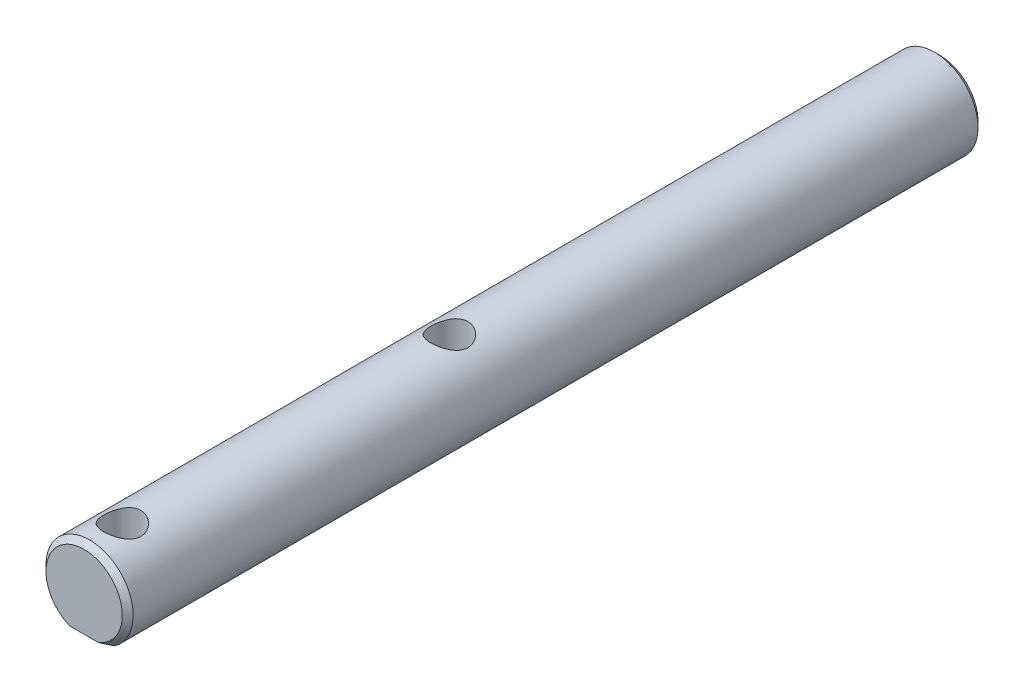
ISO-10303-21;
HEADER;
FILE_DESCRIPTION(('STEP AP214'),'2;1');
FILE_NAME('part.step','',(''),(''),'','','');
FILE_SCHEMA(('AUTOMOTIVE_DESIGN { 1 0 10303 214 1 1 1 1 }'));
ENDSEC;
DATA;
#1=APPLICATION_CONTEXT('core data for automotive mechanical design processes');
#2=APPLICATION_PROTOCOL_DEFINITION('international standard','automotive_design',2000,#1);
#3=PRODUCT_CONTEXT('',#1,'mechanical');
#4=PRODUCT('Part','Part','',(#3));
#5=PRODUCT_RELATED_PRODUCT_CATEGORY('part','',(#4));
#6=PRODUCT_DEFINITION_FORMATION('','',#4);
#7=PRODUCT_DEFINITION_CONTEXT('part definition',#1,'design');
#8=PRODUCT_DEFINITION('design','',#6,#7);
#9=PRODUCT_DEFINITION_SHAPE('','',#8);
#10=(LENGTH_UNIT() NAMED_UNIT(*) SI_UNIT(.MILLI.,.METRE.));
#11=(NAMED_UNIT(*) PLANE_ANGLE_UNIT() SI_UNIT($,.RADIAN.));
#12=(NAMED_UNIT(*) SI_UNIT($,.STERADIAN.) SOLID_ANGLE_UNIT());
#13=UNCERTAINTY_MEASURE_WITH_UNIT(LENGTH_MEASURE(1.E-05),#10,'distance_accuracy_value','');
#14=(GEOMETRIC_REPRESENTATION_CONTEXT(3) GLOBAL_UNCERTAINTY_ASSIGNED_CONTEXT((#13)) GLOBAL_UNIT_ASSIGNED_CONTEXT((#10,
#11,#12)) REPRESENTATION_CONTEXT('',''));
#15=CARTESIAN_POINT('',(0.,0.,0.));
#16=DIRECTION('',(0.,0.,1.));
#17=DIRECTION('',(1.,0.,0.));
#18=AXIS2_PLACEMENT_3D('',#15,#16,#17);
#19=CARTESIAN_POINT('',(-4.66368952654441,-32.0025372063133,17.));
#20=DIRECTION('',(0.,1.,0.));
#21=DIRECTION('',(0.,0.,1.));
#22=AXIS2_PLACEMENT_3D('',#19,#20,#21);
#23=PLANE('',#22);
#24=DIRECTION('',(-1.,0.,0.));
#25=VECTOR('',#24,1.);
#26=CARTESIAN_POINT('',(-4.66368952654441,-32.0025372063133,32.));
#27=LINE('',#26,#25);
#28=CARTESIAN_POINT('',(2.59807621135333,-32.0025372063133,32.));
#29=VERTEX_POINT('',#28);
#30=CARTESIAN_POINT('',(-2.59807621135333,-32.0025372063133,32.));
#31=VERTEX_POINT('',#30);
#32=EDGE_CURVE('E132',#29,#31,#27,.T.);
#33=ORIENTED_EDGE('',*,*,#32,.T.);
#34=CARTESIAN_POINT('',(-2.59807621135333,-32.0025372063133,32.));
#35=CARTESIAN_POINT('',(-2.77782955962474,-32.0025372063133,31.9332543486507));
#36=CARTESIAN_POINT('',(-2.95557622744951,-32.0025372063133,31.8613418592744));
#37=CARTESIAN_POINT('',(-3.30694202505624,-32.0025372063133,31.7088578936491));
#38=CARTESIAN_POINT('',(-3.48056812697636,-32.0025372063133,31.6283025401057));
#39=CARTESIAN_POINT('',(-3.82416875820724,-32.0025372063133,31.459984581549));
#40=CARTESIAN_POINT('',(-3.9941446984827,-32.0025372063133,31.3722248270392));
#41=CARTESIAN_POINT('',(-4.33114070800265,-32.0025372063133,31.1904704356699));
#42=CARTESIAN_POINT('',(-4.49815478157211,-32.0025372063133,31.0964646544571));
#43=CARTESIAN_POINT('',(-4.66368952654441,-32.0025372063133,31.));
#44=B_SPLINE_CURVE_WITH_KNOTS('',3,(#34,#35,#36,#37,#38,#39,#40,#41,#42,#43),.UNSPECIFIED.,.F.,
.F.,(4,2,2,2,4),(0.,0.575037516020766,1.14902039763858,1.72277726094883,2.29758685661788),.UNSPECIFIED.);
#45=CARTESIAN_POINT('',(-4.66368952654441,-32.0025372063133,31.));
#46=VERTEX_POINT('',#45);
#47=EDGE_CURVE('E73',#31,#46,#44,.T.);
#48=ORIENTED_EDGE('',*,*,#47,.T.);
#49=DIRECTION('',(0.,0.,1.));
#50=VECTOR('',#49,1.);
#51=CARTESIAN_POINT('',(-4.66368952654441,-32.0025372063133,17.));
#52=LINE('',#51,#50);
#53=CARTESIAN_POINT('',(-4.66368952654441,-32.0025372063133,17.));
#54=VERTEX_POINT('',#53);
#55=EDGE_CURVE('E140',#54,#46,#52,.T.);
#56=ORIENTED_EDGE('',*,*,#55,.F.);
#57=DIRECTION('',(-1.,0.,0.));
#58=VECTOR('',#57,1.);
#59=CARTESIAN_POINT('',(-4.66368952654441,-32.0025372063133,17.));
#60=LINE('',#59,#58);
#61=CARTESIAN_POINT('',(4.66368952654441,-32.0025372063133,17.));
#62=VERTEX_POINT('',#61);
#63=EDGE_CURVE('E135',#62,#54,#60,.T.);
#64=ORIENTED_EDGE('',*,*,#63,.F.);
#65=DIRECTION('',(0.,0.,1.));
#66=VECTOR('',#65,1.);
#67=CARTESIAN_POINT('',(4.66368952654441,-32.0025372063133,17.));
#68=LINE('',#67,#66);
#69=CARTESIAN_POINT('',(4.66368952654441,-32.0025372063133,31.));
#70=VERTEX_POINT('',#69);
#71=EDGE_CURVE('E138',#62,#70,#68,.T.);
#72=ORIENTED_EDGE('',*,*,#71,.T.);
#73=CARTESIAN_POINT('',(4.66368952654441,-32.0025372063133,31.));
#74=CARTESIAN_POINT('',(4.49815478157211,-32.0025372063133,31.0964646544571));
#75=CARTESIAN_POINT('',(4.33114070800265,-32.0025372063133,31.1904704356699));
#76=CARTESIAN_POINT('',(3.9941446984827,-32.0025372063133,31.3722248270392));
#77=CARTESIAN_POINT('',(3.82416875820723,-32.0025372063133,31.459984581549));
#78=CARTESIAN_POINT('',(3.48056812697636,-32.0025372063133,31.6283025401057));
#79=CARTESIAN_POINT('',(3.30694202505624,-32.0025372063133,31.7088578936491));
#80=CARTESIAN_POINT('',(2.95557622744951,-32.0025372063133,31.8613418592744));
#81=CARTESIAN_POINT('',(2.77782955962474,-32.0025372063133,31.9332543486507));
#82=CARTESIAN_POINT('',(2.59807621135333,-32.0025372063133,32.));
#83=B_SPLINE_CURVE_WITH_KNOTS('',3,(#73,#74,#75,#76,#77,#78,#79,#80,#81,#82),.UNSPECIFIED.,.F.,
.F.,(4,2,2,2,4),(0.,0.574809595669042,1.14856645897929,1.72254934059711,2.29758685661787),.UNSPECIFIED.);
#84=EDGE_CURVE('E152',#70,#29,#83,.T.);
#85=ORIENTED_EDGE('',*,*,#84,.T.);
#86=EDGE_LOOP('',(#33,#48,#56,#64,#72,#85));
#87=FACE_BOUND('',#86,.T.);
#88=CARTESIAN_POINT('',(0.,-32.0025372063133,25.));
#89=DIRECTION('',(0.,-1.,0.));
#90=DIRECTION('',(0.,0.,-1.));
#91=AXIS2_PLACEMENT_3D('',#88,#89,#90);
#92=CIRCLE('',#91,3.39999999999999);
#93=CARTESIAN_POINT('',(0.,-32.0025372063133,21.6));
#94=VERTEX_POINT('',#93);
#95=EDGE_CURVE('E229',#94,#94,#92,.T.);
#96=ORIENTED_EDGE('',*,*,#95,.F.);
#97=EDGE_LOOP('',(#96));
#98=FACE_BOUND('',#97,.T.);
#99=ADVANCED_FACE('F43',(#87,#98),#23,.F.);
#100=CARTESIAN_POINT('',(0.,-25.5025372063133,-125.));
#101=DIRECTION('',(0.,0.,1.));
#102=DIRECTION('',(1.,0.,0.));
#103=AXIS2_PLACEMENT_3D('',#100,#101,#102);
#104=CYLINDRICAL_SURFACE('',#103,8.);
#105=CARTESIAN_POINT('',(0.,-17.5025372063133,21.6));
#106=CARTESIAN_POINT('',(-0.0909425470836715,-17.5025379892364,21.6000010536183));
#107=CARTESIAN_POINT('',(-0.181917907651452,-17.5040937406981,21.6036561857398));
#108=CARTESIAN_POINT('',(-0.363195689911932,-17.5102692680175,21.6182282065863));
#109=CARTESIAN_POINT('',(-0.453497663394782,-17.5148909274405,21.6291495593847));
#110=CARTESIAN_POINT('',(-0.722727085564993,-17.5332269408711,21.6727384426478));
#111=CARTESIAN_POINT('',(-0.899738396369408,-17.5514119073917,21.7162304733698));
#112=CARTESIAN_POINT('',(-1.24264964466991,-17.5977433248496,21.8300749775124));
#113=CARTESIAN_POINT('',(-1.40858555104895,-17.6258554557092,21.9003349742289));
#114=CARTESIAN_POINT('',(-1.72618850334375,-17.6893116394396,22.065330627303));
#115=CARTESIAN_POINT('',(-1.87785953602516,-17.7246536628707,22.1600594171958));
#116=CARTESIAN_POINT('',(-2.17068103453996,-17.8011000196736,22.3764809430923));
#117=CARTESIAN_POINT('',(-2.31099328834539,-17.8423979621024,22.4992380474972));
#118=CARTESIAN_POINT('',(-2.56976762754167,-17.9252825488109,22.76597865193));
#119=CARTESIAN_POINT('',(-2.68821777363565,-17.9668693380479,22.909973673604));
#120=CARTESIAN_POINT('',(-2.9059585382015,-18.048034026677,23.2241134675255));
#121=CARTESIAN_POINT('',(-3.00394296733016,-18.0873971028665,23.3952249537767));
#122=CARTESIAN_POINT('',(-3.16936499117076,-18.1565706848382,23.7534124064121));
#123=CARTESIAN_POINT('',(-3.23681894714841,-18.1863863045856,23.9404797580219));
#124=CARTESIAN_POINT('',(-3.33577021903332,-18.2309852143207,24.3156251686166));
#125=CARTESIAN_POINT('',(-3.3688832887316,-18.2464400354364,24.5031940488701));
#126=CARTESIAN_POINT('',(-3.40324961269615,-18.2624895131299,24.8818132518886));
#127=CARTESIAN_POINT('',(-3.40452147400267,-18.2630928484639,25.0728614761008));
#128=CARTESIAN_POINT('',(-3.37638260430799,-18.2499371571766,25.4366144562482));
#129=CARTESIAN_POINT('',(-3.3494295922112,-18.2373285244298,25.6095594422947));
#130=CARTESIAN_POINT('',(-3.26974117241513,-18.2011203908341,25.9481884169489));
#131=CARTESIAN_POINT('',(-3.21700058826268,-18.1775186833417,26.1138709404512));
#132=CARTESIAN_POINT('',(-3.08619769521699,-18.1214450175569,26.4375416375082));
#133=CARTESIAN_POINT('',(-3.00761142765708,-18.0887919229106,26.5952852697046));
#134=CARTESIAN_POINT('',(-2.82772003050083,-18.0183327394854,26.8959762207295));
#135=CARTESIAN_POINT('',(-2.72640574443799,-17.9805245762917,27.0389175421134));
#136=CARTESIAN_POINT('',(-2.49344288879779,-17.8999578170823,27.3192260768247));
#137=CARTESIAN_POINT('',(-2.35990618629214,-17.8570568218455,27.4549877076809));
#138=CARTESIAN_POINT('',(-2.07155336717805,-17.7739431073796,27.702741078234));
#139=CARTESIAN_POINT('',(-1.91673187514469,-17.7337310710662,27.814726795143));
#140=CARTESIAN_POINT('',(-1.58515690001149,-17.6592714009353,28.0142350611268));
#141=CARTESIAN_POINT('',(-1.40795338529906,-17.6251971655016,28.1010792226648));
#142=CARTESIAN_POINT('',(-1.0396330708414,-17.5681942042091,28.2431560033281));
#143=CARTESIAN_POINT('',(-0.848524350924698,-17.5452590643471,28.2984068174789));
#144=CARTESIAN_POINT('',(-0.471214421933847,-17.5143316556563,28.3723095185413));
#145=CARTESIAN_POINT('',(-0.285506867563476,-17.5054618855559,28.3931145633278));
#146=CARTESIAN_POINT('',(0.0869438601955607,-17.5008446759226,28.4039857557648));
#147=CARTESIAN_POINT('',(0.273686703789193,-17.5050932731026,28.3940611873636));
#148=CARTESIAN_POINT('',(0.632656252218829,-17.5256696111259,28.3452735668923));
#149=CARTESIAN_POINT('',(0.805132433522925,-17.5413567047403,28.3079446498811));
#150=CARTESIAN_POINT('',(1.1411713045737,-17.5825369656712,28.2075677445915));
#151=CARTESIAN_POINT('',(1.30473287693416,-17.6080313590543,28.1445165405635));
#152=CARTESIAN_POINT('',(1.62406863709746,-17.6673848298662,27.9924331796158));
#153=CARTESIAN_POINT('',(1.77944074042262,-17.7014800307909,27.9026519152016));
#154=CARTESIAN_POINT('',(2.07347297649424,-17.7744264736083,27.7004772029052));
#155=CARTESIAN_POINT('',(2.21212597811334,-17.8132797307934,27.5880741604253));
#156=CARTESIAN_POINT('',(2.47960841915128,-17.8951372269852,27.3341003031485));
#157=CARTESIAN_POINT('',(2.60694543684337,-17.938235549364,27.1909840328701));
#158=CARTESIAN_POINT('',(2.83623706557249,-18.0211828693356,26.8847691796084));
#159=CARTESIAN_POINT('',(2.93818502130918,-18.0610310131137,26.7216653739237));
#160=CARTESIAN_POINT('',(3.11516255048367,-18.1333382488976,26.3762359671392));
#161=CARTESIAN_POINT('',(3.18971126170258,-18.1656619984758,26.1936335378781));
#162=CARTESIAN_POINT('',(3.30634430223466,-18.2174678794922,25.8166555551608));
#163=CARTESIAN_POINT('',(3.34845686560252,-18.2369611770463,25.6222903999106));
#164=CARTESIAN_POINT('',(3.39616357585724,-18.2591470043477,25.2439318002671));
#165=CARTESIAN_POINT('',(3.40439189958179,-18.2630506716037,25.0603402636784));
#166=CARTESIAN_POINT('',(3.39118684946154,-18.2568551377826,24.6944874067615));
#167=CARTESIAN_POINT('',(3.36975849214962,-18.2467583049392,24.5122258667017));
#168=CARTESIAN_POINT('',(3.30009044710933,-18.214825311254,24.1636912577012));
#169=CARTESIAN_POINT('',(3.25325576136447,-18.1936061428417,23.9970752841232));
#170=CARTESIAN_POINT('',(3.13550889148387,-18.1423276608396,23.67404382131));
#171=CARTESIAN_POINT('',(3.06458988583055,-18.1122658430268,23.5176312370086));
#172=CARTESIAN_POINT('',(2.8956811755921,-18.0444014058927,23.20894856023));
#173=CARTESIAN_POINT('',(2.79629603217409,-18.0062366877418,23.0575233252093));
#174=CARTESIAN_POINT('',(2.57517933394294,-17.9274326020393,22.7726742331663));
#175=CARTESIAN_POINT('',(2.45343953771841,-17.8867923255372,22.6392570466857));
#176=CARTESIAN_POINT('',(2.17997991248158,-17.8038596236214,22.3836335374284));
#177=CARTESIAN_POINT('',(2.02667281206226,-17.7616811869677,22.2630831911388));
#178=CARTESIAN_POINT('',(1.70035343830384,-17.6835321965848,22.049274480012));
#179=CARTESIAN_POINT('',(1.52733227455573,-17.6475644622217,21.9560284967745));
#180=CARTESIAN_POINT('',(1.25808018786603,-17.6015603624482,21.8398342257795));
#181=CARTESIAN_POINT('',(1.16739003836446,-17.5876221037744,21.8052134264652));
#182=CARTESIAN_POINT('',(0.983036437059015,-17.562621310114,21.7437660348138));
#183=CARTESIAN_POINT('',(0.88937442577971,-17.5515574050585,21.7169357283961));
#184=CARTESIAN_POINT('',(0.700027567815813,-17.5326564349261,21.6714229221338));
#185=CARTESIAN_POINT('',(0.604348281734738,-17.524811476273,21.6527204841897));
#186=CARTESIAN_POINT('',(0.411567256370455,-17.5125481456365,21.6235963261841));
#187=CARTESIAN_POINT('',(0.314466596404989,-17.5081272984288,21.613168624341));
#188=CARTESIAN_POINT('',(0.180959829588518,-17.5045022184466,21.604625773785));
#189=CARTESIAN_POINT('',(0.144795127375073,-17.5037658107664,21.6028916722703));
#190=CARTESIAN_POINT('',(0.0724220179547234,-17.5027831475635,21.6005785726431));
#191=CARTESIAN_POINT('',(0.0362136105249585,-17.5025368945509,21.5999995804459));
#192=CARTESIAN_POINT('',(0.,-17.5025372063133,21.6));
#193=B_SPLINE_CURVE_WITH_KNOTS('',3,(#105,#106,#107,#108,#109,#110,#111,#112,#113,#114,#115,
#116,#117,#118,#119,#120,#121,#122,#123,#124,#125,#126,#127,#128,#129,#130,#131,#132,#133,#134,
#135,#136,#137,#138,#139,#140,#141,#142,#143,#144,#145,#146,#147,#148,#149,#150,#151,#152,#153,
#154,#155,#156,#157,#158,#159,#160,#161,#162,#163,#164,#165,#166,#167,#168,#169,#170,#171,#172,
#173,#174,#175,#176,#177,#178,#179,#180,#181,#182,#183,#184,#185,#186,#187,#188,#189,#190,#191,
#192),.UNSPECIFIED.,.T.,.F.,(4,2,2,2,2,2,2,2,2,2,2,2,2,2,2,2,2,2,2,2,2,2,2,2,2,2,2,2,2,2,2,2,2,
2,2,2,2,2,2,2,2,2,2,4),(0.,0.272787950655773,0.545743646188688,1.09236438292502,
1.63711355753173,2.18171002967139,2.75209343627813,3.32278742391738,3.9229688003244,
4.52282815789096,5.09297031642632,5.66277929332668,6.18679320245948,6.71091234242782,
7.2463892188875,7.78208221227641,8.36505761580371,8.94818051982271,9.54581973646217,
10.1431144172381,10.7014292856587,11.2595754939488,11.7886515825139,12.3177938354115,
12.8634424063909,13.4093228934252,13.9957102246937,14.582251105776,15.1786431598126,
15.7745154956807,16.323073424174,16.8715385734867,17.3923747200265,17.9133585086934,
18.4663494233018,19.0195446179367,19.6153656142885,20.2114563782569,20.505338137751,
20.7990795596013,21.0920962937937,21.384901013613,21.4935254840122,21.6021505106663),.UNSPECIFIED.);
#194=CARTESIAN_POINT('',(0.,-17.5025372063133,21.6));
#195=VERTEX_POINT('',#194);
#196=EDGE_CURVE('E11',#195,#195,#193,.T.);
#197=ORIENTED_EDGE('',*,*,#196,.F.);
#198=EDGE_LOOP('',(#197));
#199=FACE_BOUND('',#198,.T.);
#200=CARTESIAN_POINT('',(0.,-17.5025372063133,-38.4));
#201=CARTESIAN_POINT('',(-0.0909425470836717,-17.5025379892364,-38.3999989463817));
#202=CARTESIAN_POINT('',(-0.181917907651453,-17.5040937406981,-38.3963438142602));
#203=CARTESIAN_POINT('',(-0.363195689911932,-17.5102692680175,-38.3817717934137));
#204=CARTESIAN_POINT('',(-0.453497663394782,-17.5148909274405,-38.3708504406153));
#205=CARTESIAN_POINT('',(-0.722727085564993,-17.5332269408711,-38.3272615573522));
#206=CARTESIAN_POINT('',(-0.899738396369409,-17.5514119073917,-38.2837695266302));
#207=CARTESIAN_POINT('',(-1.24264964466991,-17.5977433248496,-38.1699250224876));
#208=CARTESIAN_POINT('',(-1.40858555104895,-17.6258554557092,-38.0996650257711));
#209=CARTESIAN_POINT('',(-1.72618850334375,-17.6893116394396,-37.934669372697));
#210=CARTESIAN_POINT('',(-1.87785953602516,-17.7246536628707,-37.8399405828042));
#211=CARTESIAN_POINT('',(-2.17068103453996,-17.8011000196736,-37.6235190569077));
#212=CARTESIAN_POINT('',(-2.31099328834539,-17.8423979621024,-37.5007619525028));
#213=CARTESIAN_POINT('',(-2.56976762754166,-17.9252825488109,-37.23402134807));
#214=CARTESIAN_POINT('',(-2.68821777363565,-17.9668693380479,-37.090026326396));
#215=CARTESIAN_POINT('',(-2.9059585382015,-18.048034026677,-36.7758865324745));
#216=CARTESIAN_POINT('',(-3.00394296733016,-18.0873971028665,-36.6047750462233));
#217=CARTESIAN_POINT('',(-3.16936499117076,-18.1565706848382,-36.2465875935879));
#218=CARTESIAN_POINT('',(-3.23681894714841,-18.1863863045856,-36.0595202419781));
#219=CARTESIAN_POINT('',(-3.33577021903332,-18.2309852143207,-35.6843748313834));
#220=CARTESIAN_POINT('',(-3.36888328873159,-18.2464400354364,-35.4968059511299));
#221=CARTESIAN_POINT('',(-3.40324961269615,-18.2624895131299,-35.1181867481114));
#222=CARTESIAN_POINT('',(-3.40452147400267,-18.2630928484639,-34.9271385238992));
#223=CARTESIAN_POINT('',(-3.37638260430799,-18.2499371571766,-34.5633855437518));
#224=CARTESIAN_POINT('',(-3.3494295922112,-18.2373285244298,-34.3904405577053));
#225=CARTESIAN_POINT('',(-3.26974117241513,-18.2011203908341,-34.0518115830511));
#226=CARTESIAN_POINT('',(-3.21700058826269,-18.1775186833417,-33.8861290595488));
#227=CARTESIAN_POINT('',(-3.086197695217,-18.1214450175569,-33.5624583624918));
#228=CARTESIAN_POINT('',(-3.00761142765708,-18.0887919229106,-33.4047147302954));
#229=CARTESIAN_POINT('',(-2.82772003050083,-18.0183327394854,-33.1040237792705));
#230=CARTESIAN_POINT('',(-2.726405744438,-17.9805245762917,-32.9610824578866));
#231=CARTESIAN_POINT('',(-2.49344288879779,-17.8999578170823,-32.6807739231753));
#232=CARTESIAN_POINT('',(-2.35990618629213,-17.8570568218455,-32.5450122923191));
#233=CARTESIAN_POINT('',(-2.07155336717804,-17.7739431073796,-32.297258921766));
#234=CARTESIAN_POINT('',(-1.91673187514469,-17.7337310710662,-32.185273204857));
#235=CARTESIAN_POINT('',(-1.5851569000115,-17.6592714009353,-31.9857649388732));
#236=CARTESIAN_POINT('',(-1.40795338529906,-17.6251971655016,-31.8989207773352));
#237=CARTESIAN_POINT('',(-1.0396330708414,-17.5681942042091,-31.7568439966719));
#238=CARTESIAN_POINT('',(-0.848524350924704,-17.5452590643471,-31.7015931825211));
#239=CARTESIAN_POINT('',(-0.471214421933853,-17.5143316556563,-31.6276904814587));
#240=CARTESIAN_POINT('',(-0.285506867563482,-17.5054618855559,-31.6068854366722));
#241=CARTESIAN_POINT('',(0.0869438601955567,-17.5008446759226,-31.5960142442352));
#242=CARTESIAN_POINT('',(0.27368670378919,-17.5050932731026,-31.6059388126364));
#243=CARTESIAN_POINT('',(0.632656252218826,-17.5256696111259,-31.6547264331077));
#244=CARTESIAN_POINT('',(0.805132433522921,-17.5413567047403,-31.6920553501189));
#245=CARTESIAN_POINT('',(1.1411713045737,-17.5825369656712,-31.7924322554085));
#246=CARTESIAN_POINT('',(1.30473287693415,-17.6080313590543,-31.8554834594365));
#247=CARTESIAN_POINT('',(1.62406863709746,-17.6673848298662,-32.0075668203842));
#248=CARTESIAN_POINT('',(1.77944074042262,-17.7014800307909,-32.0973480847984));
#249=CARTESIAN_POINT('',(2.07347297649424,-17.7744264736083,-32.2995227970947));
#250=CARTESIAN_POINT('',(2.21212597811334,-17.8132797307934,-32.4119258395747));
#251=CARTESIAN_POINT('',(2.47960841915128,-17.8951372269852,-32.6658996968515));
#252=CARTESIAN_POINT('',(2.60694543684337,-17.938235549364,-32.8090159671299));
#253=CARTESIAN_POINT('',(2.83623706557249,-18.0211828693356,-33.1152308203916));
#254=CARTESIAN_POINT('',(2.93818502130918,-18.0610310131137,-33.2783346260763));
#255=CARTESIAN_POINT('',(3.11516255048367,-18.1333382488976,-33.6237640328608));
#256=CARTESIAN_POINT('',(3.18971126170258,-18.1656619984758,-33.8063664621218));
#257=CARTESIAN_POINT('',(3.30634430223466,-18.2174678794922,-34.1833444448392));
#258=CARTESIAN_POINT('',(3.34845686560252,-18.2369611770463,-34.3777096000893));
#259=CARTESIAN_POINT('',(3.39616357585724,-18.2591470043477,-34.7560681997329));
#260=CARTESIAN_POINT('',(3.40439189958179,-18.2630506716037,-34.9396597363215));
#261=CARTESIAN_POINT('',(3.39118684946154,-18.2568551377826,-35.3055125932385));
#262=CARTESIAN_POINT('',(3.36975849214962,-18.2467583049392,-35.4877741332983));
#263=CARTESIAN_POINT('',(3.30009044710933,-18.214825311254,-35.8363087422988));
#264=CARTESIAN_POINT('',(3.25325576136447,-18.1936061428417,-36.0029247158768));
#265=CARTESIAN_POINT('',(3.13550889148387,-18.1423276608396,-36.32595617869));
#266=CARTESIAN_POINT('',(3.06458988583055,-18.1122658430268,-36.4823687629914));
#267=CARTESIAN_POINT('',(2.89568117559211,-18.0444014058927,-36.79105143977));
#268=CARTESIAN_POINT('',(2.79629603217409,-18.0062366877418,-36.9424766747907));
#269=CARTESIAN_POINT('',(2.57517933394294,-17.9274326020393,-37.2273257668337));
#270=CARTESIAN_POINT('',(2.45343953771842,-17.8867923255372,-37.3607429533143));
#271=CARTESIAN_POINT('',(2.17997991248158,-17.8038596236214,-37.6163664625716));
#272=CARTESIAN_POINT('',(2.02667281206227,-17.7616811869677,-37.7369168088612));
#273=CARTESIAN_POINT('',(1.70035343830385,-17.6835321965848,-37.950725519988));
#274=CARTESIAN_POINT('',(1.52733227455574,-17.6475644622217,-38.0439715032255));
#275=CARTESIAN_POINT('',(1.25808018786604,-17.6015603624482,-38.1601657742205));
#276=CARTESIAN_POINT('',(1.16739003836446,-17.5876221037744,-38.1947865735348));
#277=CARTESIAN_POINT('',(0.983036437059022,-17.562621310114,-38.2562339651862));
#278=CARTESIAN_POINT('',(0.889374425779716,-17.5515574050585,-38.2830642716039));
#279=CARTESIAN_POINT('',(0.700027567815816,-17.5326564349261,-38.3285770778662));
#280=CARTESIAN_POINT('',(0.60434828173474,-17.524811476273,-38.3472795158103));
#281=CARTESIAN_POINT('',(0.411567256370456,-17.5125481456365,-38.3764036738159));
#282=CARTESIAN_POINT('',(0.314466596404991,-17.5081272984288,-38.386831375659));
#283=CARTESIAN_POINT('',(0.180959829588519,-17.5045022184466,-38.395374226215));
#284=CARTESIAN_POINT('',(0.144795127375073,-17.5037658107664,-38.3971083277297));
#285=CARTESIAN_POINT('',(0.0724220179547232,-17.5027831475635,-38.3994214273569));
#286=CARTESIAN_POINT('',(0.0362136105249584,-17.5025368945509,-38.4000004195541));
#287=CARTESIAN_POINT('',(0.,-17.5025372063133,-38.4));
#288=B_SPLINE_CURVE_WITH_KNOTS('',3,(#200,#201,#202,#203,#204,#205,#206,#207,#208,#209,#210,
#211,#212,#213,#214,#215,#216,#217,#218,#219,#220,#221,#222,#223,#224,#225,#226,#227,#228,#229,
#230,#231,#232,#233,#234,#235,#236,#237,#238,#239,#240,#241,#242,#243,#244,#245,#246,#247,#248,
#249,#250,#251,#252,#253,#254,#255,#256,#257,#258,#259,#260,#261,#262,#263,#264,#265,#266,#267,
#268,#269,#270,#271,#272,#273,#274,#275,#276,#277,#278,#279,#280,#281,#282,#283,#284,#285,#286,
#287),.UNSPECIFIED.,.T.,.F.,(4,2,2,2,2,2,2,2,2,2,2,2,2,2,2,2,2,2,2,2,2,2,2,2,2,2,2,2,2,2,2,2,2,
2,2,2,2,2,2,2,2,2,2,4),(0.,0.272787950655774,0.545743646188688,1.09236438292502,
1.63711355753172,2.18171002967139,2.75209343627813,3.32278742391738,3.92296880032439,
4.52282815789095,5.0929703164263,5.66277929332668,6.18679320245947,6.71091234242782,
7.24638921888749,7.78208221227641,8.36505761580371,8.94818051982271,9.54581973646217,
10.1431144172381,10.7014292856587,11.2595754939488,11.7886515825138,12.3177938354115,
12.8634424063909,13.4093228934252,13.9957102246937,14.582251105776,15.1786431598125,
15.7745154956807,16.323073424174,16.8715385734867,17.3923747200265,17.9133585086934,
18.4663494233018,19.0195446179367,19.6153656142885,20.2114563782569,20.505338137751,
20.7990795596013,21.0920962937937,21.384901013613,21.4935254840122,21.6021505106663),.UNSPECIFIED.);
#289=CARTESIAN_POINT('',(0.,-17.5025372063133,-38.4));
#290=VERTEX_POINT('',#289);
#291=EDGE_CURVE('E58',#290,#290,#288,.T.);
#292=ORIENTED_EDGE('',*,*,#291,.F.);
#293=EDGE_LOOP('',(#292));
#294=FACE_BOUND('',#293,.T.);
#295=CARTESIAN_POINT('',(0.,-25.5025372063133,-124.));
#296=DIRECTION('',(0.,0.,-1.));
#297=DIRECTION('',(-1.,0.,0.));
#298=AXIS2_PLACEMENT_3D('',#295,#296,#297);
#299=CIRCLE('',#298,8.);
#300=CARTESIAN_POINT('',(-8.,-25.5025372063133,-124.));
#301=VERTEX_POINT('',#300);
#302=EDGE_CURVE('E142',#301,#301,#299,.F.);
#303=ORIENTED_EDGE('',*,*,#302,.T.);
#304=EDGE_LOOP('',(#303));
#305=FACE_BOUND('',#304,.T.);
#306=CARTESIAN_POINT('',(0.,-25.5025372063133,-27.));
#307=DIRECTION('',(0.,0.,1.));
#308=DIRECTION('',(1.,0.,0.));
#309=AXIS2_PLACEMENT_3D('',#306,#307,#308);
#310=CIRCLE('',#309,8.);
#311=CARTESIAN_POINT('',(-4.66368952654441,-32.0025372063133,-27.));
#312=VERTEX_POINT('',#311);
#313=CARTESIAN_POINT('',(4.66368952654441,-32.0025372063133,-27.));
#314=VERTEX_POINT('',#313);
#315=EDGE_CURVE('E120',#312,#314,#310,.T.);
#316=ORIENTED_EDGE('',*,*,#315,.T.);
#317=DIRECTION('',(0.,0.,-1.));
#318=VECTOR('',#317,1.);
#319=CARTESIAN_POINT('',(4.66368952654441,-32.0025372063133,-27.));
#320=LINE('',#319,#318);
#321=CARTESIAN_POINT('',(4.66368952654441,-32.0025372063133,-43.));
#322=VERTEX_POINT('',#321);
#323=EDGE_CURVE('E129',#314,#322,#320,.T.);
#324=ORIENTED_EDGE('',*,*,#323,.T.);
#325=CARTESIAN_POINT('',(0.,-25.5025372063133,-43.));
#326=DIRECTION('',(0.,0.,1.));
#327=DIRECTION('',(1.,0.,0.));
#328=AXIS2_PLACEMENT_3D('',#325,#326,#327);
#329=CIRCLE('',#328,8.);
#330=CARTESIAN_POINT('',(-4.66368952654441,-32.0025372063133,-43.));
#331=VERTEX_POINT('',#330);
#332=EDGE_CURVE('E109',#331,#322,#329,.T.);
#333=ORIENTED_EDGE('',*,*,#332,.F.);
#334=DIRECTION('',(0.,0.,-1.));
#335=VECTOR('',#334,1.);
#336=CARTESIAN_POINT('',(-4.66368952654441,-32.0025372063133,-27.));
#337=LINE('',#336,#335);
#338=EDGE_CURVE('E124',#312,#331,#337,.T.);
#339=ORIENTED_EDGE('',*,*,#338,.F.);
#340=EDGE_LOOP('',(#316,#324,#333,#339));
#341=FACE_BOUND('',#340,.T.);
#342=ORIENTED_EDGE('',*,*,#55,.T.);
#343=CARTESIAN_POINT('',(0.,-25.5025372063133,31.));
#344=DIRECTION('',(0.,0.,-1.));
#345=DIRECTION('',(-1.,0.,0.));
#346=AXIS2_PLACEMENT_3D('',#343,#344,#345);
#347=CIRCLE('',#346,8.);
#348=EDGE_CURVE('E65',#46,#70,#347,.T.);
#349=ORIENTED_EDGE('',*,*,#348,.T.);
#350=ORIENTED_EDGE('',*,*,#71,.F.);
#351=CARTESIAN_POINT('',(0.,-25.5025372063133,17.));
#352=DIRECTION('',(0.,0.,1.));
#353=DIRECTION('',(1.,0.,0.));
#354=AXIS2_PLACEMENT_3D('',#351,#352,#353);
#355=CIRCLE('',#354,8.);
#356=EDGE_CURVE('E133',#54,#62,#355,.T.);
#357=ORIENTED_EDGE('',*,*,#356,.F.);
#358=EDGE_LOOP('',(#342,#349,#350,#357));
#359=FACE_BOUND('',#358,.T.);
#360=ADVANCED_FACE('F168',(#199,#294,#305,#341,#359),#104,.T.);
#361=CARTESIAN_POINT('',(0.,-25.5025372063133,-125.));
#362=DIRECTION('',(0.,0.,-1.));
#363=DIRECTION('',(-1.,0.,0.));
#364=AXIS2_PLACEMENT_3D('',#361,#362,#363);
#365=PLANE('',#364);
#366=CARTESIAN_POINT('',(0.,-25.5025372063133,-125.));
#367=DIRECTION('',(0.,0.,-1.));
#368=DIRECTION('',(-1.,0.,0.));
#369=AXIS2_PLACEMENT_3D('',#366,#367,#368);
#370=CIRCLE('',#369,7.00000000000002);
#371=CARTESIAN_POINT('',(-7.00000000000002,-25.5025372063133,-125.));
#372=VERTEX_POINT('',#371);
#373=EDGE_CURVE('E146',#372,#372,#370,.T.);
#374=ORIENTED_EDGE('',*,*,#373,.T.);
#375=EDGE_LOOP('',(#374));
#376=FACE_BOUND('',#375,.T.);
#377=CARTESIAN_POINT('',(0.,-25.5025372063133,-125.));
#378=DIRECTION('',(0.,0.,-1.));
#379=DIRECTION('',(-1.,0.,0.));
#380=AXIS2_PLACEMENT_3D('',#377,#378,#379);
#381=CIRCLE('',#380,3.4);
#382=CARTESIAN_POINT('',(-3.4,-25.5025372063133,-125.));
#383=VERTEX_POINT('',#382);
#384=EDGE_CURVE('E110',#383,#383,#381,.T.);
#385=ORIENTED_EDGE('',*,*,#384,.F.);
#386=EDGE_LOOP('',(#385));
#387=FACE_BOUND('',#386,.T.);
#388=ADVANCED_FACE('F175',(#376,#387),#365,.T.);
#389=CARTESIAN_POINT('',(0.,-25.5025372063133,32.));
#390=DIRECTION('',(0.,0.,-1.));
#391=DIRECTION('',(-1.,0.,0.));
#392=AXIS2_PLACEMENT_3D('',#389,#390,#391);
#393=PLANE('',#392);
#394=ORIENTED_EDGE('',*,*,#32,.F.);
#395=CARTESIAN_POINT('',(0.,-25.5025372063133,32.));
#396=DIRECTION('',(0.,0.,-1.));
#397=DIRECTION('',(-1.,0.,0.));
#398=AXIS2_PLACEMENT_3D('',#395,#396,#397);
#399=CIRCLE('',#398,7.00000000000001);
#400=EDGE_CURVE('E149',#29,#31,#399,.F.);
#401=ORIENTED_EDGE('',*,*,#400,.T.);
#402=EDGE_LOOP('',(#394,#401));
#403=FACE_BOUND('',#402,.T.);
#404=ADVANCED_FACE('F171',(#403),#393,.F.);
#405=CARTESIAN_POINT('',(0.,-25.5025372063133,17.));
#406=DIRECTION('',(0.,0.,1.));
#407=DIRECTION('',(1.,0.,0.));
#408=AXIS2_PLACEMENT_3D('',#405,#406,#407);
#409=PLANE('',#408);
#410=ORIENTED_EDGE('',*,*,#356,.T.);
#411=ORIENTED_EDGE('',*,*,#63,.T.);
#412=EDGE_LOOP('',(#410,#411));
#413=FACE_BOUND('',#412,.T.);
#414=ADVANCED_FACE('F169',(#413),#409,.T.);
#415=CARTESIAN_POINT('',(4.66368952654441,-32.0025372063133,-27.));
#416=DIRECTION('',(0.,-1.,0.));
#417=DIRECTION('',(0.,0.,-1.));
#418=AXIS2_PLACEMENT_3D('',#415,#416,#417);
#419=PLANE('',#418);
#420=CARTESIAN_POINT('',(0.,-32.0025372063133,-35.));
#421=DIRECTION('',(0.,-1.,0.));
#422=DIRECTION('',(0.,0.,-1.));
#423=AXIS2_PLACEMENT_3D('',#420,#421,#422);
#424=CIRCLE('',#423,3.39999999999999);
#425=CARTESIAN_POINT('',(0.,-32.0025372063133,-38.4));
#426=VERTEX_POINT('',#425);
#427=EDGE_CURVE('E116',#426,#426,#424,.T.);
#428=ORIENTED_EDGE('',*,*,#427,.F.);
#429=EDGE_LOOP('',(#428));
#430=FACE_BOUND('',#429,.T.);
#431=DIRECTION('',(-1.,0.,0.));
#432=VECTOR('',#431,1.);
#433=CARTESIAN_POINT('',(4.66368952654441,-32.0025372063133,-43.));
#434=LINE('',#433,#432);
#435=EDGE_CURVE('E113',#322,#331,#434,.T.);
#436=ORIENTED_EDGE('',*,*,#435,.F.);
#437=ORIENTED_EDGE('',*,*,#323,.F.);
#438=DIRECTION('',(-1.,0.,0.));
#439=VECTOR('',#438,1.);
#440=CARTESIAN_POINT('',(4.66368952654441,-32.0025372063133,-27.));
#441=LINE('',#440,#439);
#442=EDGE_CURVE('E123',#314,#312,#441,.T.);
#443=ORIENTED_EDGE('',*,*,#442,.T.);
#444=ORIENTED_EDGE('',*,*,#338,.T.);
#445=EDGE_LOOP('',(#436,#437,#443,#444));
#446=FACE_BOUND('',#445,.T.);
#447=ADVANCED_FACE('F202',(#430,#446),#419,.T.);
#448=CARTESIAN_POINT('',(0.,-25.5025372063133,-27.));
#449=DIRECTION('',(0.,0.,1.));
#450=DIRECTION('',(1.,0.,0.));
#451=AXIS2_PLACEMENT_3D('',#448,#449,#450);
#452=PLANE('',#451);
#453=ORIENTED_EDGE('',*,*,#315,.F.);
#454=ORIENTED_EDGE('',*,*,#442,.F.);
#455=EDGE_LOOP('',(#453,#454));
#456=FACE_BOUND('',#455,.T.);
#457=ADVANCED_FACE('F199',(#456),#452,.F.);
#458=CARTESIAN_POINT('',(0.,-25.5025372063133,-43.));
#459=DIRECTION('',(0.,0.,1.));
#460=DIRECTION('',(1.,0.,0.));
#461=AXIS2_PLACEMENT_3D('',#458,#459,#460);
#462=PLANE('',#461);
#463=ORIENTED_EDGE('',*,*,#332,.T.);
#464=ORIENTED_EDGE('',*,*,#435,.T.);
#465=EDGE_LOOP('',(#463,#464));
#466=FACE_BOUND('',#465,.T.);
#467=ADVANCED_FACE('F103',(#466),#462,.T.);
#468=CARTESIAN_POINT('',(0.,-25.5025372063133,-85.));
#469=DIRECTION('',(0.,0.,-1.));
#470=DIRECTION('',(-1.,0.,0.));
#471=AXIS2_PLACEMENT_3D('',#468,#469,#470);
#472=CONICAL_SURFACE('',#471,3.39999999999999,1.02974425867665);
#473=CARTESIAN_POINT('',(0.,-25.5025372063133,-82.9570738953063));
#474=VERTEX_POINT('',#473);
#475=VERTEX_LOOP('',#474);
#476=FACE_BOUND('',#475,.T.);
#477=CARTESIAN_POINT('',(0.,-25.5025372063133,-85.));
#478=DIRECTION('',(0.,0.,-1.));
#479=DIRECTION('',(-1.,0.,0.));
#480=AXIS2_PLACEMENT_3D('',#477,#478,#479);
#481=CIRCLE('',#480,3.39999999999999);
#482=CARTESIAN_POINT('',(-3.39999999999999,-25.5025372063133,-85.));
#483=VERTEX_POINT('',#482);
#484=EDGE_CURVE('E107',#483,#483,#481,.T.);
#485=ORIENTED_EDGE('',*,*,#484,.T.);
#486=EDGE_LOOP('',(#485));
#487=FACE_BOUND('',#486,.T.);
#488=ADVANCED_FACE('F99',(#476,#487),#472,.F.);
#489=CARTESIAN_POINT('',(0.,-25.5025372063133,-125.));
#490=DIRECTION('',(0.,0.,-1.));
#491=DIRECTION('',(-1.,0.,0.));
#492=AXIS2_PLACEMENT_3D('',#489,#490,#491);
#493=CYLINDRICAL_SURFACE('',#492,3.4);
#494=ORIENTED_EDGE('',*,*,#484,.F.);
#495=EDGE_LOOP('',(#494));
#496=FACE_BOUND('',#495,.T.);
#497=ORIENTED_EDGE('',*,*,#384,.T.);
#498=EDGE_LOOP('',(#497));
#499=FACE_BOUND('',#498,.T.);
#500=ADVANCED_FACE('F102',(#496,#499),#493,.F.);
#501=CARTESIAN_POINT('',(0.,-25.5025372063133,-124.));
#502=DIRECTION('',(0.,0.,1.));
#503=DIRECTION('',(1.,0.,0.));
#504=AXIS2_PLACEMENT_3D('',#501,#502,#503);
#505=CONICAL_SURFACE('',#504,8.,0.785398163397452);
#506=ORIENTED_EDGE('',*,*,#373,.F.);
#507=EDGE_LOOP('',(#506));
#508=FACE_BOUND('',#507,.T.);
#509=ORIENTED_EDGE('',*,*,#302,.F.);
#510=EDGE_LOOP('',(#509));
#511=FACE_BOUND('',#510,.T.);
#512=ADVANCED_FACE('F183',(#508,#511),#505,.T.);
#513=CARTESIAN_POINT('',(0.,-25.5025372063133,32.));
#514=DIRECTION('',(0.,0.,-1.));
#515=DIRECTION('',(-1.,0.,0.));
#516=AXIS2_PLACEMENT_3D('',#513,#514,#515);
#517=CONICAL_SURFACE('',#516,7.00000000000001,0.785398163397445);
#518=ORIENTED_EDGE('',*,*,#84,.F.);
#519=ORIENTED_EDGE('',*,*,#348,.F.);
#520=ORIENTED_EDGE('',*,*,#47,.F.);
#521=ORIENTED_EDGE('',*,*,#400,.F.);
#522=EDGE_LOOP('',(#518,#519,#520,#521));
#523=FACE_BOUND('',#522,.T.);
#524=ADVANCED_FACE('F46',(#523),#517,.T.);
#525=CARTESIAN_POINT('',(0.,-32.0025372063133,-35.));
#526=DIRECTION('',(0.,-1.,0.));
#527=DIRECTION('',(0.,0.,-1.));
#528=AXIS2_PLACEMENT_3D('',#525,#526,#527);
#529=CYLINDRICAL_SURFACE('',#528,3.39999999999999);
#530=ORIENTED_EDGE('',*,*,#291,.T.);
#531=EDGE_LOOP('',(#530));
#532=FACE_BOUND('',#531,.T.);
#533=ORIENTED_EDGE('',*,*,#427,.T.);
#534=EDGE_LOOP('',(#533));
#535=FACE_BOUND('',#534,.T.);
#536=ADVANCED_FACE('F190',(#532,#535),#529,.F.);
#537=CARTESIAN_POINT('',(0.,-32.0025372063133,25.));
#538=DIRECTION('',(0.,-1.,0.));
#539=DIRECTION('',(0.,0.,-1.));
#540=AXIS2_PLACEMENT_3D('',#537,#538,#539);
#541=CYLINDRICAL_SURFACE('',#540,3.39999999999999);
#542=ORIENTED_EDGE('',*,*,#196,.T.);
#543=EDGE_LOOP('',(#542));
#544=FACE_BOUND('',#543,.T.);
#545=ORIENTED_EDGE('',*,*,#95,.T.);
#546=EDGE_LOOP('',(#545));
#547=FACE_BOUND('',#546,.T.);
#548=ADVANCED_FACE('F194',(#544,#547),#541,.F.);
#549=CLOSED_SHELL('',(#99,#360,#388,#404,#414,#447,#457,#467,#488,#500,#512,#524,#536,#548));
#550=MANIFOLD_SOLID_BREP('B2',#549);
#551=ADVANCED_BREP_SHAPE_REPRESENTATION('',(#18,#550),#14);
#552=SHAPE_DEFINITION_REPRESENTATION(#9,#551);
ENDSEC;
END-ISO-10303-21;
